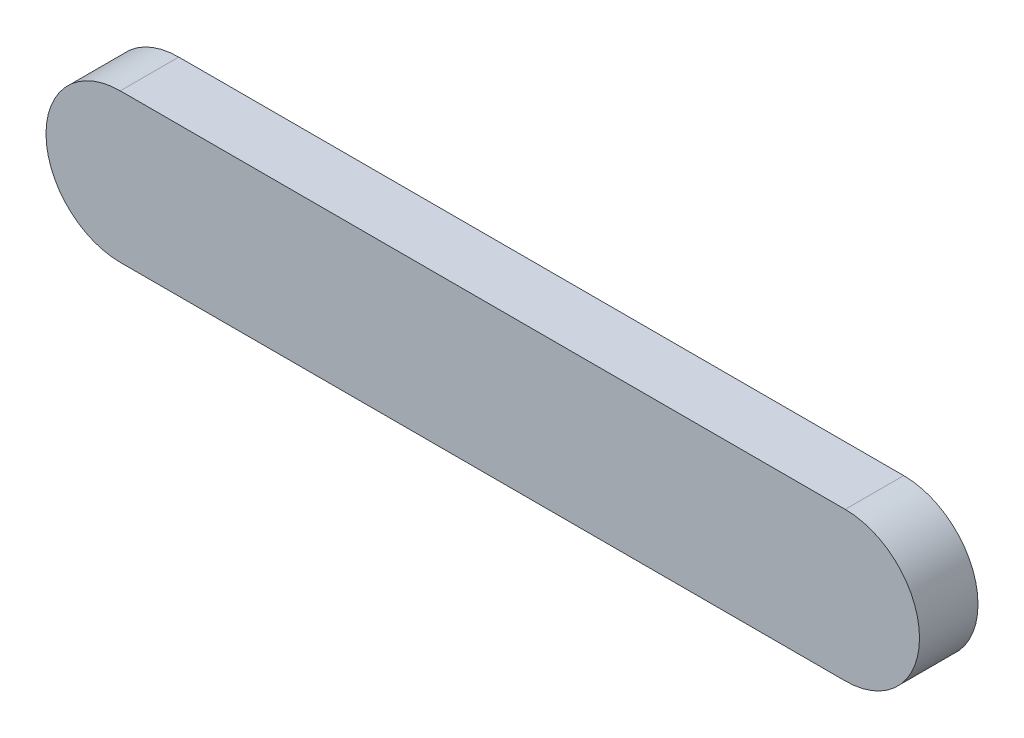
ISO-10303-21;
HEADER;
FILE_DESCRIPTION(('STEP AP214'),'2;1');
FILE_NAME('part.step','',(''),(''),'','','');
FILE_SCHEMA(('AUTOMOTIVE_DESIGN { 1 0 10303 214 1 1 1 1 }'));
ENDSEC;
DATA;
#1=APPLICATION_CONTEXT('core data for automotive mechanical design processes');
#2=APPLICATION_PROTOCOL_DEFINITION('international standard','automotive_design',2000,#1);
#3=PRODUCT_CONTEXT('',#1,'mechanical');
#4=PRODUCT('Part','Part','',(#3));
#5=PRODUCT_RELATED_PRODUCT_CATEGORY('part','',(#4));
#6=PRODUCT_DEFINITION_FORMATION('','',#4);
#7=PRODUCT_DEFINITION_CONTEXT('part definition',#1,'design');
#8=PRODUCT_DEFINITION('design','',#6,#7);
#9=PRODUCT_DEFINITION_SHAPE('','',#8);
#10=(LENGTH_UNIT() NAMED_UNIT(*) SI_UNIT(.MILLI.,.METRE.));
#11=(NAMED_UNIT(*) PLANE_ANGLE_UNIT() SI_UNIT($,.RADIAN.));
#12=(NAMED_UNIT(*) SI_UNIT($,.STERADIAN.) SOLID_ANGLE_UNIT());
#13=UNCERTAINTY_MEASURE_WITH_UNIT(LENGTH_MEASURE(1.E-05),#10,'distance_accuracy_value','');
#14=(GEOMETRIC_REPRESENTATION_CONTEXT(3) GLOBAL_UNCERTAINTY_ASSIGNED_CONTEXT((#13)) GLOBAL_UNIT_ASSIGNED_CONTEXT((#10,
#11,#12)) REPRESENTATION_CONTEXT('',''));
#15=CARTESIAN_POINT('',(0.,0.,0.));
#16=DIRECTION('',(0.,0.,1.));
#17=DIRECTION('',(1.,0.,0.));
#18=AXIS2_PLACEMENT_3D('',#15,#16,#17);
#19=CARTESIAN_POINT('',(88.9,64.77,0.));
#20=DIRECTION('',(0.,1.,0.));
#21=DIRECTION('',(1.,0.,0.));
#22=AXIS2_PLACEMENT_3D('',#19,#20,#21);
#23=PLANE('',#22);
#24=DIRECTION('',(1.,0.,0.));
#25=VECTOR('',#24,1.);
#26=CARTESIAN_POINT('',(88.9,64.77,0.1999996));
#27=LINE('',#26,#25);
#28=CARTESIAN_POINT('',(88.9,64.77,0.1999996));
#29=VERTEX_POINT('',#28);
#30=CARTESIAN_POINT('',(91.37836944,64.77,0.1999996));
#31=VERTEX_POINT('',#30);
#32=EDGE_CURVE('E11',#29,#31,#27,.T.);
#33=ORIENTED_EDGE('',*,*,#32,.F.);
#34=DIRECTION('',(0.,0.,1.));
#35=VECTOR('',#34,1.);
#36=CARTESIAN_POINT('',(88.9,64.77,0.));
#37=LINE('',#36,#35);
#38=CARTESIAN_POINT('',(88.9,64.77,0.));
#39=VERTEX_POINT('',#38);
#40=EDGE_CURVE('E24',#39,#29,#37,.T.);
#41=ORIENTED_EDGE('',*,*,#40,.F.);
#42=DIRECTION('',(1.,0.,0.));
#43=VECTOR('',#42,1.);
#44=CARTESIAN_POINT('',(88.9,64.77,0.));
#45=LINE('',#44,#43);
#46=CARTESIAN_POINT('',(91.37836944,64.77,0.));
#47=VERTEX_POINT('',#46);
#48=EDGE_CURVE('E75',#39,#47,#45,.T.);
#49=ORIENTED_EDGE('',*,*,#48,.T.);
#50=DIRECTION('',(0.,0.,1.));
#51=VECTOR('',#50,1.);
#52=CARTESIAN_POINT('',(91.37836944,64.77,0.));
#53=LINE('',#52,#51);
#54=EDGE_CURVE('E37',#47,#31,#53,.T.);
#55=ORIENTED_EDGE('',*,*,#54,.T.);
#56=EDGE_LOOP('',(#33,#41,#49,#55));
#57=FACE_BOUND('',#56,.T.);
#58=ADVANCED_FACE('F17',(#57),#23,.F.);
#59=CARTESIAN_POINT('',(91.37836944,65.024,0.));
#60=DIRECTION('',(0.,0.,-1.));
#61=DIRECTION('',(0.,-1.,0.));
#62=AXIS2_PLACEMENT_3D('',#59,#60,#61);
#63=CYLINDRICAL_SURFACE('',#62,0.25400000000001);
#64=CARTESIAN_POINT('',(91.37836944,65.024,0.1999996));
#65=DIRECTION('',(0.,0.,1.));
#66=DIRECTION('',(0.,-1.,0.));
#67=AXIS2_PLACEMENT_3D('',#64,#65,#66);
#68=CIRCLE('',#67,0.25400000000001);
#69=CARTESIAN_POINT('',(91.37836944,65.278,0.1999996));
#70=VERTEX_POINT('',#69);
#71=EDGE_CURVE('E83',#31,#70,#68,.T.);
#72=ORIENTED_EDGE('',*,*,#71,.F.);
#73=ORIENTED_EDGE('',*,*,#54,.F.);
#74=CARTESIAN_POINT('',(91.37836944,65.024,0.));
#75=DIRECTION('',(0.,0.,1.));
#76=DIRECTION('',(0.,-1.,0.));
#77=AXIS2_PLACEMENT_3D('',#74,#75,#76);
#78=CIRCLE('',#77,0.25400000000001);
#79=CARTESIAN_POINT('',(91.37836944,65.278,0.));
#80=VERTEX_POINT('',#79);
#81=EDGE_CURVE('E81',#47,#80,#78,.T.);
#82=ORIENTED_EDGE('',*,*,#81,.T.);
#83=DIRECTION('',(0.,0.,1.));
#84=VECTOR('',#83,1.);
#85=CARTESIAN_POINT('',(91.37836944,65.278,0.));
#86=LINE('',#85,#84);
#87=EDGE_CURVE('E67',#80,#70,#86,.T.);
#88=ORIENTED_EDGE('',*,*,#87,.T.);
#89=EDGE_LOOP('',(#72,#73,#82,#88));
#90=FACE_BOUND('',#89,.T.);
#91=ADVANCED_FACE('F89',(#90),#63,.T.);
#92=CARTESIAN_POINT('',(91.37836944,65.278,0.));
#93=DIRECTION('',(0.,-1.,0.));
#94=DIRECTION('',(-1.,0.,0.));
#95=AXIS2_PLACEMENT_3D('',#92,#93,#94);
#96=PLANE('',#95);
#97=DIRECTION('',(-1.,0.,0.));
#98=VECTOR('',#97,1.);
#99=CARTESIAN_POINT('',(91.37836944,65.278,0.1999996));
#100=LINE('',#99,#98);
#101=CARTESIAN_POINT('',(88.9,65.278,0.1999996));
#102=VERTEX_POINT('',#101);
#103=EDGE_CURVE('E71',#70,#102,#100,.T.);
#104=ORIENTED_EDGE('',*,*,#103,.F.);
#105=ORIENTED_EDGE('',*,*,#87,.F.);
#106=DIRECTION('',(-1.,0.,0.));
#107=VECTOR('',#106,1.);
#108=CARTESIAN_POINT('',(91.37836944,65.278,0.));
#109=LINE('',#108,#107);
#110=CARTESIAN_POINT('',(88.9,65.278,0.));
#111=VERTEX_POINT('',#110);
#112=EDGE_CURVE('E63',#80,#111,#109,.T.);
#113=ORIENTED_EDGE('',*,*,#112,.T.);
#114=DIRECTION('',(0.,0.,1.));
#115=VECTOR('',#114,1.);
#116=CARTESIAN_POINT('',(88.9,65.278,0.));
#117=LINE('',#116,#115);
#118=EDGE_CURVE('E53',#111,#102,#117,.T.);
#119=ORIENTED_EDGE('',*,*,#118,.T.);
#120=EDGE_LOOP('',(#104,#105,#113,#119));
#121=FACE_BOUND('',#120,.T.);
#122=ADVANCED_FACE('F66',(#121),#96,.F.);
#123=CARTESIAN_POINT('',(88.9,65.024,0.));
#124=DIRECTION('',(0.,0.,-1.));
#125=DIRECTION('',(0.,1.,0.));
#126=AXIS2_PLACEMENT_3D('',#123,#124,#125);
#127=CYLINDRICAL_SURFACE('',#126,0.254000000000005);
#128=CARTESIAN_POINT('',(88.9,65.024,0.1999996));
#129=DIRECTION('',(0.,0.,1.));
#130=DIRECTION('',(0.,1.,0.));
#131=AXIS2_PLACEMENT_3D('',#128,#129,#130);
#132=CIRCLE('',#131,0.254000000000005);
#133=EDGE_CURVE('E59',#102,#29,#132,.T.);
#134=ORIENTED_EDGE('',*,*,#133,.F.);
#135=ORIENTED_EDGE('',*,*,#118,.F.);
#136=CARTESIAN_POINT('',(88.9,65.024,0.));
#137=DIRECTION('',(0.,0.,1.));
#138=DIRECTION('',(0.,1.,0.));
#139=AXIS2_PLACEMENT_3D('',#136,#137,#138);
#140=CIRCLE('',#139,0.254000000000005);
#141=EDGE_CURVE('E57',#111,#39,#140,.T.);
#142=ORIENTED_EDGE('',*,*,#141,.T.);
#143=ORIENTED_EDGE('',*,*,#40,.T.);
#144=EDGE_LOOP('',(#134,#135,#142,#143));
#145=FACE_BOUND('',#144,.T.);
#146=ADVANCED_FACE('F55',(#145),#127,.T.);
#147=CARTESIAN_POINT('',(88.9,64.77,0.));
#148=DIRECTION('',(0.,0.,-1.));
#149=DIRECTION('',(-1.,0.,0.));
#150=AXIS2_PLACEMENT_3D('',#147,#148,#149);
#151=PLANE('',#150);
#152=ORIENTED_EDGE('',*,*,#141,.F.);
#153=ORIENTED_EDGE('',*,*,#112,.F.);
#154=ORIENTED_EDGE('',*,*,#81,.F.);
#155=ORIENTED_EDGE('',*,*,#48,.F.);
#156=EDGE_LOOP('',(#152,#153,#154,#155));
#157=FACE_BOUND('',#156,.T.);
#158=ADVANCED_FACE('F74',(#157),#151,.T.);
#159=CARTESIAN_POINT('',(88.9,64.77,0.1999996));
#160=DIRECTION('',(0.,0.,-1.));
#161=DIRECTION('',(-1.,0.,0.));
#162=AXIS2_PLACEMENT_3D('',#159,#160,#161);
#163=PLANE('',#162);
#164=ORIENTED_EDGE('',*,*,#32,.T.);
#165=ORIENTED_EDGE('',*,*,#71,.T.);
#166=ORIENTED_EDGE('',*,*,#103,.T.);
#167=ORIENTED_EDGE('',*,*,#133,.T.);
#168=EDGE_LOOP('',(#164,#165,#166,#167));
#169=FACE_BOUND('',#168,.T.);
#170=ADVANCED_FACE('F91',(#169),#163,.F.);
#171=CLOSED_SHELL('',(#58,#91,#122,#146,#158,#170));
#172=MANIFOLD_SOLID_BREP('B1',#171);
#173=ADVANCED_BREP_SHAPE_REPRESENTATION('',(#18,#172),#14);
#174=SHAPE_DEFINITION_REPRESENTATION(#9,#173);
ENDSEC;
END-ISO-10303-21;
